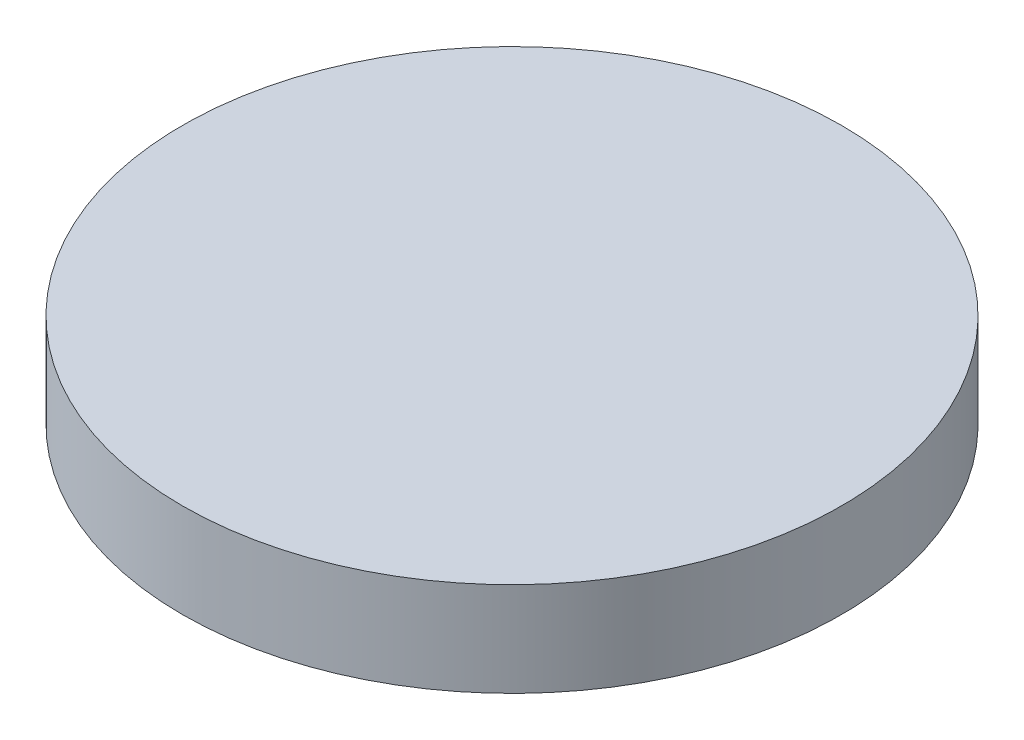
ISO-10303-21;
HEADER;
FILE_DESCRIPTION(('STEP AP214'),'2;1');
FILE_NAME('part.step','',(''),(''),'','','');
FILE_SCHEMA(('AUTOMOTIVE_DESIGN { 1 0 10303 214 1 1 1 1 }'));
ENDSEC;
DATA;
#1=APPLICATION_CONTEXT('core data for automotive mechanical design processes');
#2=APPLICATION_PROTOCOL_DEFINITION('international standard','automotive_design',2000,#1);
#3=PRODUCT_CONTEXT('',#1,'mechanical');
#4=PRODUCT('Part','Part','',(#3));
#5=PRODUCT_RELATED_PRODUCT_CATEGORY('part','',(#4));
#6=PRODUCT_DEFINITION_FORMATION('','',#4);
#7=PRODUCT_DEFINITION_CONTEXT('part definition',#1,'design');
#8=PRODUCT_DEFINITION('design','',#6,#7);
#9=PRODUCT_DEFINITION_SHAPE('','',#8);
#10=(LENGTH_UNIT() NAMED_UNIT(*) SI_UNIT(.MILLI.,.METRE.));
#11=(NAMED_UNIT(*) PLANE_ANGLE_UNIT() SI_UNIT($,.RADIAN.));
#12=(NAMED_UNIT(*) SI_UNIT($,.STERADIAN.) SOLID_ANGLE_UNIT());
#13=UNCERTAINTY_MEASURE_WITH_UNIT(LENGTH_MEASURE(1.E-05),#10,'distance_accuracy_value','');
#14=(GEOMETRIC_REPRESENTATION_CONTEXT(3) GLOBAL_UNCERTAINTY_ASSIGNED_CONTEXT((#13)) GLOBAL_UNIT_ASSIGNED_CONTEXT((#10,
#11,#12)) REPRESENTATION_CONTEXT('',''));
#15=CARTESIAN_POINT('',(0.,0.,0.));
#16=DIRECTION('',(0.,0.,1.));
#17=DIRECTION('',(1.,0.,0.));
#18=AXIS2_PLACEMENT_3D('',#15,#16,#17);
#19=CARTESIAN_POINT('',(0.,20.,0.));
#20=DIRECTION('',(0.,-1.,0.));
#21=DIRECTION('',(0.,0.,-1.));
#22=AXIS2_PLACEMENT_3D('',#19,#20,#21);
#23=CYLINDRICAL_SURFACE('',#22,70.);
#24=CARTESIAN_POINT('',(0.,20.,0.));
#25=DIRECTION('',(0.,1.,0.));
#26=DIRECTION('',(0.,0.,1.));
#27=AXIS2_PLACEMENT_3D('',#24,#25,#26);
#28=CIRCLE('',#27,70.);
#29=CARTESIAN_POINT('',(0.,20.,70.));
#30=VERTEX_POINT('',#29);
#31=EDGE_CURVE('E10',#30,#30,#28,.T.);
#32=ORIENTED_EDGE('',*,*,#31,.F.);
#33=EDGE_LOOP('',(#32));
#34=FACE_BOUND('',#33,.T.);
#35=CARTESIAN_POINT('',(0.,0.,0.));
#36=DIRECTION('',(0.,1.,0.));
#37=DIRECTION('',(0.,0.,1.));
#38=AXIS2_PLACEMENT_3D('',#35,#36,#37);
#39=CIRCLE('',#38,70.);
#40=CARTESIAN_POINT('',(0.,0.,70.));
#41=VERTEX_POINT('',#40);
#42=EDGE_CURVE('E38',#41,#41,#39,.T.);
#43=ORIENTED_EDGE('',*,*,#42,.T.);
#44=EDGE_LOOP('',(#43));
#45=FACE_BOUND('',#44,.T.);
#46=ADVANCED_FACE('F35',(#34,#45),#23,.T.);
#47=CARTESIAN_POINT('',(0.,20.,0.));
#48=DIRECTION('',(0.,1.,0.));
#49=DIRECTION('',(0.,0.,1.));
#50=AXIS2_PLACEMENT_3D('',#47,#48,#49);
#51=PLANE('',#50);
#52=ORIENTED_EDGE('',*,*,#31,.T.);
#53=EDGE_LOOP('',(#52));
#54=FACE_BOUND('',#53,.T.);
#55=ADVANCED_FACE('F50',(#54),#51,.T.);
#56=CARTESIAN_POINT('',(0.,0.,0.));
#57=DIRECTION('',(0.,1.,0.));
#58=DIRECTION('',(0.,0.,1.));
#59=AXIS2_PLACEMENT_3D('',#56,#57,#58);
#60=PLANE('',#59);
#61=ORIENTED_EDGE('',*,*,#42,.F.);
#62=EDGE_LOOP('',(#61));
#63=FACE_BOUND('',#62,.T.);
#64=ADVANCED_FACE('F48',(#63),#60,.F.);
#65=CLOSED_SHELL('',(#46,#55,#64));
#66=MANIFOLD_SOLID_BREP('B2',#65);
#67=ADVANCED_BREP_SHAPE_REPRESENTATION('',(#18,#66),#14);
#68=SHAPE_DEFINITION_REPRESENTATION(#9,#67);
ENDSEC;
END-ISO-10303-21;
